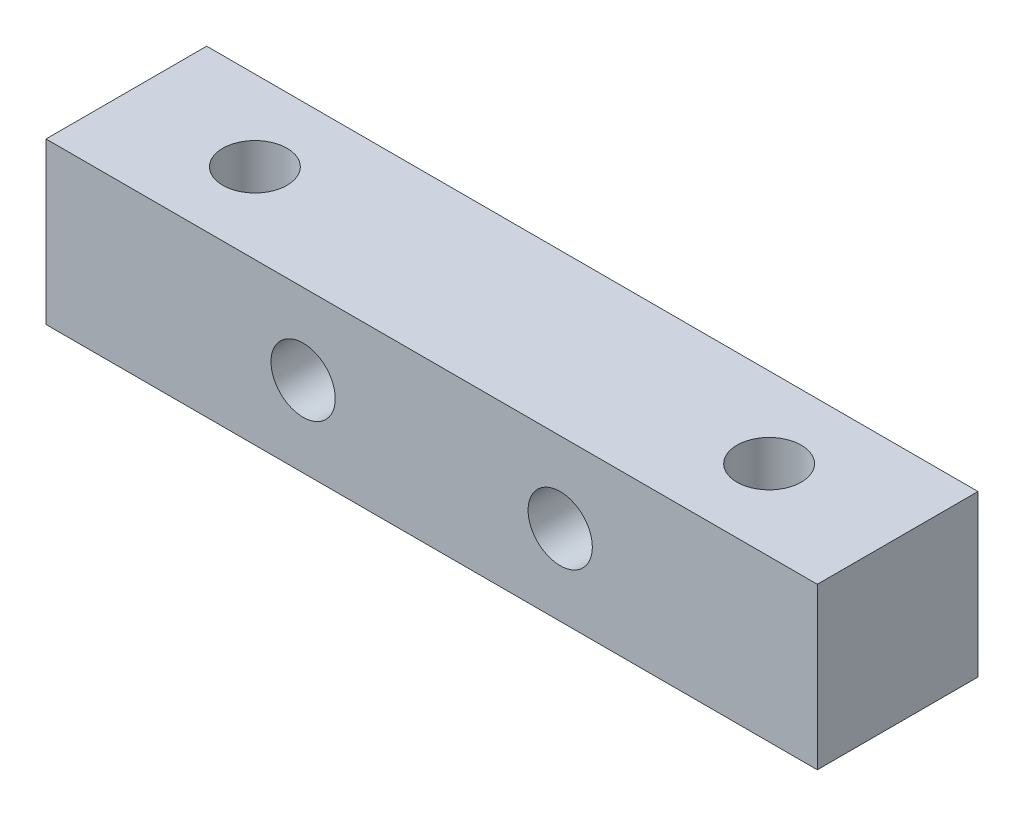
ISO-10303-21;
HEADER;
FILE_DESCRIPTION(('STEP AP214'),'2;1');
FILE_NAME('part.step','',(''),(''),'','','');
FILE_SCHEMA(('AUTOMOTIVE_DESIGN { 1 0 10303 214 1 1 1 1 }'));
ENDSEC;
DATA;
#1=APPLICATION_CONTEXT('core data for automotive mechanical design processes');
#2=APPLICATION_PROTOCOL_DEFINITION('international standard','automotive_design',2000,#1);
#3=PRODUCT_CONTEXT('',#1,'mechanical');
#4=PRODUCT('Part','Part','',(#3));
#5=PRODUCT_RELATED_PRODUCT_CATEGORY('part','',(#4));
#6=PRODUCT_DEFINITION_FORMATION('','',#4);
#7=PRODUCT_DEFINITION_CONTEXT('part definition',#1,'design');
#8=PRODUCT_DEFINITION('design','',#6,#7);
#9=PRODUCT_DEFINITION_SHAPE('','',#8);
#10=(LENGTH_UNIT() NAMED_UNIT(*) SI_UNIT(.MILLI.,.METRE.));
#11=(NAMED_UNIT(*) PLANE_ANGLE_UNIT() SI_UNIT($,.RADIAN.));
#12=(NAMED_UNIT(*) SI_UNIT($,.STERADIAN.) SOLID_ANGLE_UNIT());
#13=UNCERTAINTY_MEASURE_WITH_UNIT(LENGTH_MEASURE(1.E-05),#10,'distance_accuracy_value','');
#14=(GEOMETRIC_REPRESENTATION_CONTEXT(3) GLOBAL_UNCERTAINTY_ASSIGNED_CONTEXT((#13)) GLOBAL_UNIT_ASSIGNED_CONTEXT((#10,
#11,#12)) REPRESENTATION_CONTEXT('',''));
#15=CARTESIAN_POINT('',(0.,0.,0.));
#16=DIRECTION('',(0.,0.,1.));
#17=DIRECTION('',(1.,0.,0.));
#18=AXIS2_PLACEMENT_3D('',#15,#16,#17);
#19=CARTESIAN_POINT('',(0.,10.,0.));
#20=DIRECTION('',(0.,-1.,0.));
#21=DIRECTION('',(0.,0.,-1.));
#22=AXIS2_PLACEMENT_3D('',#19,#20,#21);
#23=PLANE('',#22);
#24=DIRECTION('',(0.,0.,-1.));
#25=VECTOR('',#24,1.);
#26=CARTESIAN_POINT('',(24.,10.,5.));
#27=LINE('',#26,#25);
#28=CARTESIAN_POINT('',(24.,10.,5.));
#29=VERTEX_POINT('',#28);
#30=CARTESIAN_POINT('',(24.,10.,-5.));
#31=VERTEX_POINT('',#30);
#32=EDGE_CURVE('E96',#29,#31,#27,.T.);
#33=ORIENTED_EDGE('',*,*,#32,.T.);
#34=DIRECTION('',(-1.,0.,0.));
#35=VECTOR('',#34,1.);
#36=CARTESIAN_POINT('',(-24.,10.,-5.));
#37=LINE('',#36,#35);
#38=CARTESIAN_POINT('',(-24.,10.,-5.));
#39=VERTEX_POINT('',#38);
#40=EDGE_CURVE('E91',#31,#39,#37,.T.);
#41=ORIENTED_EDGE('',*,*,#40,.T.);
#42=DIRECTION('',(0.,0.,1.));
#43=VECTOR('',#42,1.);
#44=CARTESIAN_POINT('',(-24.,10.,5.));
#45=LINE('',#44,#43);
#46=CARTESIAN_POINT('',(-24.,10.,5.));
#47=VERTEX_POINT('',#46);
#48=EDGE_CURVE('E94',#39,#47,#45,.T.);
#49=ORIENTED_EDGE('',*,*,#48,.T.);
#50=DIRECTION('',(1.,0.,0.));
#51=VECTOR('',#50,1.);
#52=CARTESIAN_POINT('',(-24.,10.,5.));
#53=LINE('',#52,#51);
#54=EDGE_CURVE('E61',#47,#29,#53,.T.);
#55=ORIENTED_EDGE('',*,*,#54,.T.);
#56=EDGE_LOOP('',(#33,#41,#49,#55));
#57=FACE_BOUND('',#56,.T.);
#58=CARTESIAN_POINT('',(16.,10.,0.));
#59=DIRECTION('',(0.,1.,0.));
#60=DIRECTION('',(0.,0.,1.));
#61=AXIS2_PLACEMENT_3D('',#58,#59,#60);
#62=CIRCLE('',#61,2.);
#63=CARTESIAN_POINT('',(16.,10.,2.));
#64=VERTEX_POINT('',#63);
#65=EDGE_CURVE('E116',#64,#64,#62,.T.);
#66=ORIENTED_EDGE('',*,*,#65,.F.);
#67=EDGE_LOOP('',(#66));
#68=FACE_BOUND('',#67,.T.);
#69=CARTESIAN_POINT('',(-16.,10.,0.));
#70=DIRECTION('',(0.,1.,0.));
#71=DIRECTION('',(0.,0.,1.));
#72=AXIS2_PLACEMENT_3D('',#69,#70,#71);
#73=CIRCLE('',#72,2.);
#74=CARTESIAN_POINT('',(-16.,10.,2.));
#75=VERTEX_POINT('',#74);
#76=EDGE_CURVE('E138',#75,#75,#73,.T.);
#77=ORIENTED_EDGE('',*,*,#76,.F.);
#78=EDGE_LOOP('',(#77));
#79=FACE_BOUND('',#78,.T.);
#80=ADVANCED_FACE('F43',(#57,#68,#79),#23,.F.);
#81=CARTESIAN_POINT('',(0.,0.,0.));
#82=DIRECTION('',(0.,-1.,0.));
#83=DIRECTION('',(0.,0.,-1.));
#84=AXIS2_PLACEMENT_3D('',#81,#82,#83);
#85=PLANE('',#84);
#86=CARTESIAN_POINT('',(16.,0.,0.));
#87=DIRECTION('',(0.,1.,0.));
#88=DIRECTION('',(0.,0.,1.));
#89=AXIS2_PLACEMENT_3D('',#86,#87,#88);
#90=CIRCLE('',#89,2.);
#91=CARTESIAN_POINT('',(16.,0.,2.));
#92=VERTEX_POINT('',#91);
#93=EDGE_CURVE('E134',#92,#92,#90,.T.);
#94=ORIENTED_EDGE('',*,*,#93,.T.);
#95=EDGE_LOOP('',(#94));
#96=FACE_BOUND('',#95,.T.);
#97=DIRECTION('',(0.,0.,-1.));
#98=VECTOR('',#97,1.);
#99=CARTESIAN_POINT('',(24.,0.,5.));
#100=LINE('',#99,#98);
#101=CARTESIAN_POINT('',(24.,0.,5.));
#102=VERTEX_POINT('',#101);
#103=CARTESIAN_POINT('',(24.,0.,-5.));
#104=VERTEX_POINT('',#103);
#105=EDGE_CURVE('E112',#102,#104,#100,.T.);
#106=ORIENTED_EDGE('',*,*,#105,.F.);
#107=DIRECTION('',(1.,0.,0.));
#108=VECTOR('',#107,1.);
#109=CARTESIAN_POINT('',(-24.,0.,5.));
#110=LINE('',#109,#108);
#111=CARTESIAN_POINT('',(-24.,0.,5.));
#112=VERTEX_POINT('',#111);
#113=EDGE_CURVE('E84',#112,#102,#110,.T.);
#114=ORIENTED_EDGE('',*,*,#113,.F.);
#115=DIRECTION('',(0.,0.,1.));
#116=VECTOR('',#115,1.);
#117=CARTESIAN_POINT('',(-24.,0.,5.));
#118=LINE('',#117,#116);
#119=CARTESIAN_POINT('',(-24.,0.,-5.));
#120=VERTEX_POINT('',#119);
#121=EDGE_CURVE('E78',#120,#112,#118,.T.);
#122=ORIENTED_EDGE('',*,*,#121,.F.);
#123=DIRECTION('',(-1.,0.,0.));
#124=VECTOR('',#123,1.);
#125=CARTESIAN_POINT('',(-24.,0.,-5.));
#126=LINE('',#125,#124);
#127=EDGE_CURVE('E101',#104,#120,#126,.T.);
#128=ORIENTED_EDGE('',*,*,#127,.F.);
#129=EDGE_LOOP('',(#106,#114,#122,#128));
#130=FACE_BOUND('',#129,.T.);
#131=CARTESIAN_POINT('',(-16.,0.,0.));
#132=DIRECTION('',(0.,1.,0.));
#133=DIRECTION('',(0.,0.,1.));
#134=AXIS2_PLACEMENT_3D('',#131,#132,#133);
#135=CIRCLE('',#134,2.);
#136=CARTESIAN_POINT('',(-16.,0.,2.));
#137=VERTEX_POINT('',#136);
#138=EDGE_CURVE('E142',#137,#137,#135,.T.);
#139=ORIENTED_EDGE('',*,*,#138,.T.);
#140=EDGE_LOOP('',(#139));
#141=FACE_BOUND('',#140,.T.);
#142=ADVANCED_FACE('F129',(#96,#130,#141),#85,.T.);
#143=CARTESIAN_POINT('',(24.,10.,5.));
#144=DIRECTION('',(-1.,0.,0.));
#145=DIRECTION('',(0.,0.,1.));
#146=AXIS2_PLACEMENT_3D('',#143,#144,#145);
#147=PLANE('',#146);
#148=ORIENTED_EDGE('',*,*,#105,.T.);
#149=DIRECTION('',(0.,-1.,0.));
#150=VECTOR('',#149,1.);
#151=CARTESIAN_POINT('',(24.,10.,-5.));
#152=LINE('',#151,#150);
#153=EDGE_CURVE('E11',#31,#104,#152,.T.);
#154=ORIENTED_EDGE('',*,*,#153,.F.);
#155=ORIENTED_EDGE('',*,*,#32,.F.);
#156=DIRECTION('',(0.,-1.,0.));
#157=VECTOR('',#156,1.);
#158=CARTESIAN_POINT('',(24.,10.,5.));
#159=LINE('',#158,#157);
#160=EDGE_CURVE('E108',#29,#102,#159,.T.);
#161=ORIENTED_EDGE('',*,*,#160,.T.);
#162=EDGE_LOOP('',(#148,#154,#155,#161));
#163=FACE_BOUND('',#162,.T.);
#164=ADVANCED_FACE('F45',(#163),#147,.F.);
#165=CARTESIAN_POINT('',(-24.,10.,-5.));
#166=DIRECTION('',(0.,0.,1.));
#167=DIRECTION('',(1.,0.,0.));
#168=AXIS2_PLACEMENT_3D('',#165,#166,#167);
#169=PLANE('',#168);
#170=CARTESIAN_POINT('',(-8.00000000000001,5.,-5.));
#171=DIRECTION('',(0.,0.,1.));
#172=DIRECTION('',(1.,0.,0.));
#173=AXIS2_PLACEMENT_3D('',#170,#171,#172);
#174=CIRCLE('',#173,2.);
#175=CARTESIAN_POINT('',(-6.00000000000001,5.,-5.));
#176=VERTEX_POINT('',#175);
#177=EDGE_CURVE('E146',#176,#176,#174,.T.);
#178=ORIENTED_EDGE('',*,*,#177,.T.);
#179=EDGE_LOOP('',(#178));
#180=FACE_BOUND('',#179,.T.);
#181=CARTESIAN_POINT('',(7.99999999999999,5.,-5.));
#182=DIRECTION('',(0.,0.,1.));
#183=DIRECTION('',(1.,0.,0.));
#184=AXIS2_PLACEMENT_3D('',#181,#182,#183);
#185=CIRCLE('',#184,2.);
#186=CARTESIAN_POINT('',(9.99999999999999,5.,-5.));
#187=VERTEX_POINT('',#186);
#188=EDGE_CURVE('E150',#187,#187,#185,.T.);
#189=ORIENTED_EDGE('',*,*,#188,.T.);
#190=EDGE_LOOP('',(#189));
#191=FACE_BOUND('',#190,.T.);
#192=ORIENTED_EDGE('',*,*,#127,.T.);
#193=DIRECTION('',(0.,-1.,0.));
#194=VECTOR('',#193,1.);
#195=CARTESIAN_POINT('',(-24.,10.,-5.));
#196=LINE('',#195,#194);
#197=EDGE_CURVE('E53',#39,#120,#196,.T.);
#198=ORIENTED_EDGE('',*,*,#197,.F.);
#199=ORIENTED_EDGE('',*,*,#40,.F.);
#200=ORIENTED_EDGE('',*,*,#153,.T.);
#201=EDGE_LOOP('',(#192,#198,#199,#200));
#202=FACE_BOUND('',#201,.T.);
#203=ADVANCED_FACE('F100',(#180,#191,#202),#169,.F.);
#204=CARTESIAN_POINT('',(-24.,10.,5.));
#205=DIRECTION('',(1.,0.,0.));
#206=DIRECTION('',(0.,0.,-1.));
#207=AXIS2_PLACEMENT_3D('',#204,#205,#206);
#208=PLANE('',#207);
#209=ORIENTED_EDGE('',*,*,#121,.T.);
#210=DIRECTION('',(0.,-1.,0.));
#211=VECTOR('',#210,1.);
#212=CARTESIAN_POINT('',(-24.,10.,5.));
#213=LINE('',#212,#211);
#214=EDGE_CURVE('E103',#47,#112,#213,.T.);
#215=ORIENTED_EDGE('',*,*,#214,.F.);
#216=ORIENTED_EDGE('',*,*,#48,.F.);
#217=ORIENTED_EDGE('',*,*,#197,.T.);
#218=EDGE_LOOP('',(#209,#215,#216,#217));
#219=FACE_BOUND('',#218,.T.);
#220=ADVANCED_FACE('F104',(#219),#208,.F.);
#221=CARTESIAN_POINT('',(-24.,10.,5.));
#222=DIRECTION('',(0.,0.,-1.));
#223=DIRECTION('',(-1.,0.,0.));
#224=AXIS2_PLACEMENT_3D('',#221,#222,#223);
#225=PLANE('',#224);
#226=CARTESIAN_POINT('',(-8.00000000000001,5.,5.));
#227=DIRECTION('',(0.,0.,1.));
#228=DIRECTION('',(1.,0.,0.));
#229=AXIS2_PLACEMENT_3D('',#226,#227,#228);
#230=CIRCLE('',#229,2.);
#231=CARTESIAN_POINT('',(-6.00000000000001,5.,5.));
#232=VERTEX_POINT('',#231);
#233=EDGE_CURVE('E158',#232,#232,#230,.T.);
#234=ORIENTED_EDGE('',*,*,#233,.F.);
#235=EDGE_LOOP('',(#234));
#236=FACE_BOUND('',#235,.T.);
#237=CARTESIAN_POINT('',(7.99999999999999,5.,5.));
#238=DIRECTION('',(0.,0.,1.));
#239=DIRECTION('',(1.,0.,0.));
#240=AXIS2_PLACEMENT_3D('',#237,#238,#239);
#241=CIRCLE('',#240,2.);
#242=CARTESIAN_POINT('',(9.99999999999999,5.,5.));
#243=VERTEX_POINT('',#242);
#244=EDGE_CURVE('E154',#243,#243,#241,.T.);
#245=ORIENTED_EDGE('',*,*,#244,.F.);
#246=EDGE_LOOP('',(#245));
#247=FACE_BOUND('',#246,.T.);
#248=ORIENTED_EDGE('',*,*,#113,.T.);
#249=ORIENTED_EDGE('',*,*,#160,.F.);
#250=ORIENTED_EDGE('',*,*,#54,.F.);
#251=ORIENTED_EDGE('',*,*,#214,.T.);
#252=EDGE_LOOP('',(#248,#249,#250,#251));
#253=FACE_BOUND('',#252,.T.);
#254=ADVANCED_FACE('F126',(#236,#247,#253),#225,.F.);
#255=CARTESIAN_POINT('',(16.,10.,0.));
#256=DIRECTION('',(0.,-1.,0.));
#257=DIRECTION('',(0.,0.,-1.));
#258=AXIS2_PLACEMENT_3D('',#255,#256,#257);
#259=CYLINDRICAL_SURFACE('',#258,2.);
#260=ORIENTED_EDGE('',*,*,#65,.T.);
#261=EDGE_LOOP('',(#260));
#262=FACE_BOUND('',#261,.T.);
#263=ORIENTED_EDGE('',*,*,#93,.F.);
#264=EDGE_LOOP('',(#263));
#265=FACE_BOUND('',#264,.T.);
#266=ADVANCED_FACE('F177',(#262,#265),#259,.F.);
#267=CARTESIAN_POINT('',(-16.,10.,0.));
#268=DIRECTION('',(0.,-1.,0.));
#269=DIRECTION('',(0.,0.,-1.));
#270=AXIS2_PLACEMENT_3D('',#267,#268,#269);
#271=CYLINDRICAL_SURFACE('',#270,2.);
#272=ORIENTED_EDGE('',*,*,#76,.T.);
#273=EDGE_LOOP('',(#272));
#274=FACE_BOUND('',#273,.T.);
#275=ORIENTED_EDGE('',*,*,#138,.F.);
#276=EDGE_LOOP('',(#275));
#277=FACE_BOUND('',#276,.T.);
#278=ADVANCED_FACE('F182',(#274,#277),#271,.F.);
#279=CARTESIAN_POINT('',(7.99999999999999,5.,-5.));
#280=DIRECTION('',(0.,0.,1.));
#281=DIRECTION('',(1.,0.,0.));
#282=AXIS2_PLACEMENT_3D('',#279,#280,#281);
#283=CYLINDRICAL_SURFACE('',#282,2.);
#284=ORIENTED_EDGE('',*,*,#188,.F.);
#285=EDGE_LOOP('',(#284));
#286=FACE_BOUND('',#285,.T.);
#287=ORIENTED_EDGE('',*,*,#244,.T.);
#288=EDGE_LOOP('',(#287));
#289=FACE_BOUND('',#288,.T.);
#290=ADVANCED_FACE('F171',(#286,#289),#283,.F.);
#291=CARTESIAN_POINT('',(-8.00000000000001,5.,-5.));
#292=DIRECTION('',(0.,0.,1.));
#293=DIRECTION('',(1.,0.,0.));
#294=AXIS2_PLACEMENT_3D('',#291,#292,#293);
#295=CYLINDRICAL_SURFACE('',#294,2.);
#296=ORIENTED_EDGE('',*,*,#177,.F.);
#297=EDGE_LOOP('',(#296));
#298=FACE_BOUND('',#297,.T.);
#299=ORIENTED_EDGE('',*,*,#233,.T.);
#300=EDGE_LOOP('',(#299));
#301=FACE_BOUND('',#300,.T.);
#302=ADVANCED_FACE('F168',(#298,#301),#295,.F.);
#303=CLOSED_SHELL('',(#80,#142,#164,#203,#220,#254,#266,#278,#290,#302));
#304=MANIFOLD_SOLID_BREP('B2',#303);
#305=ADVANCED_BREP_SHAPE_REPRESENTATION('',(#18,#304),#14);
#306=SHAPE_DEFINITION_REPRESENTATION(#9,#305);
ENDSEC;
END-ISO-10303-21;
